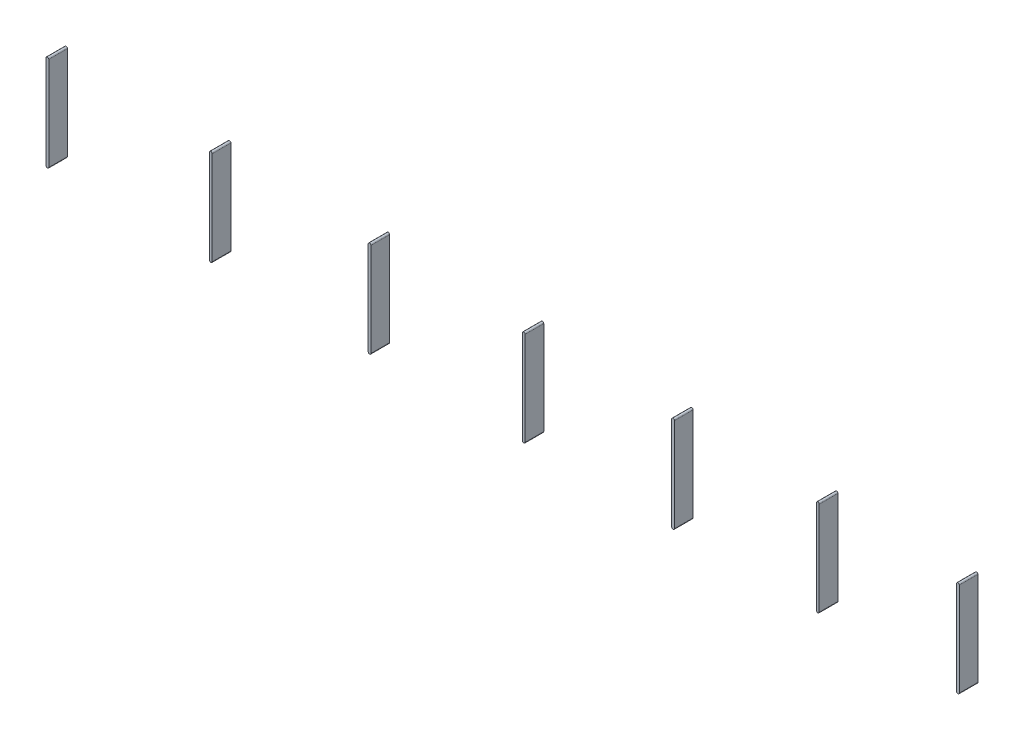
ISO-10303-21;
HEADER;
FILE_DESCRIPTION(('STEP AP214'),'2;1');
FILE_NAME('part.step','',(''),(''),'','','');
FILE_SCHEMA(('AUTOMOTIVE_DESIGN { 1 0 10303 214 1 1 1 1 }'));
ENDSEC;
DATA;
#1=APPLICATION_CONTEXT('core data for automotive mechanical design processes');
#2=APPLICATION_PROTOCOL_DEFINITION('international standard','automotive_design',2000,#1);
#3=PRODUCT_CONTEXT('',#1,'mechanical');
#4=PRODUCT('Part','Part','',(#3));
#5=PRODUCT_RELATED_PRODUCT_CATEGORY('part','',(#4));
#6=PRODUCT_DEFINITION_FORMATION('','',#4);
#7=PRODUCT_DEFINITION_CONTEXT('part definition',#1,'design');
#8=PRODUCT_DEFINITION('design','',#6,#7);
#9=PRODUCT_DEFINITION_SHAPE('','',#8);
#10=(LENGTH_UNIT() NAMED_UNIT(*) SI_UNIT(.MILLI.,.METRE.));
#11=(NAMED_UNIT(*) PLANE_ANGLE_UNIT() SI_UNIT($,.RADIAN.));
#12=(NAMED_UNIT(*) SI_UNIT($,.STERADIAN.) SOLID_ANGLE_UNIT());
#13=UNCERTAINTY_MEASURE_WITH_UNIT(LENGTH_MEASURE(1.E-05),#10,'distance_accuracy_value','');
#14=(GEOMETRIC_REPRESENTATION_CONTEXT(3) GLOBAL_UNCERTAINTY_ASSIGNED_CONTEXT((#13)) GLOBAL_UNIT_ASSIGNED_CONTEXT((#10,
#11,#12)) REPRESENTATION_CONTEXT('',''));
#15=CARTESIAN_POINT('',(0.,0.,0.));
#16=DIRECTION('',(0.,0.,1.));
#17=DIRECTION('',(1.,0.,0.));
#18=AXIS2_PLACEMENT_3D('',#15,#16,#17);
#19=CARTESIAN_POINT('',(-134.,0.,4.));
#20=DIRECTION('',(0.,0.,-1.));
#21=DIRECTION('',(-1.,0.,0.));
#22=AXIS2_PLACEMENT_3D('',#19,#20,#21);
#23=CYLINDRICAL_SURFACE('',#22,0.300000000000022);
#24=CARTESIAN_POINT('',(-134.,0.,0.));
#25=DIRECTION('',(0.,0.,1.));
#26=DIRECTION('',(1.,0.,0.));
#27=AXIS2_PLACEMENT_3D('',#24,#25,#26);
#28=CIRCLE('',#27,0.300000000000022);
#29=CARTESIAN_POINT('',(-133.7,0.,0.));
#30=VERTEX_POINT('',#29);
#31=CARTESIAN_POINT('',(-134.3,0.,0.));
#32=VERTEX_POINT('',#31);
#33=EDGE_CURVE('E107',#30,#32,#28,.T.);
#34=ORIENTED_EDGE('',*,*,#33,.T.);
#35=DIRECTION('',(0.,0.,-1.));
#36=VECTOR('',#35,1.);
#37=CARTESIAN_POINT('',(-134.3,0.,4.));
#38=LINE('',#37,#36);
#39=CARTESIAN_POINT('',(-134.3,0.,4.));
#40=VERTEX_POINT('',#39);
#41=EDGE_CURVE('E12',#40,#32,#38,.T.);
#42=ORIENTED_EDGE('',*,*,#41,.F.);
#43=CARTESIAN_POINT('',(-134.,0.,4.));
#44=DIRECTION('',(0.,0.,1.));
#45=DIRECTION('',(1.,0.,0.));
#46=AXIS2_PLACEMENT_3D('',#43,#44,#45);
#47=CIRCLE('',#46,0.300000000000022);
#48=CARTESIAN_POINT('',(-133.7,0.,4.));
#49=VERTEX_POINT('',#48);
#50=EDGE_CURVE('E95',#49,#40,#47,.T.);
#51=ORIENTED_EDGE('',*,*,#50,.F.);
#52=DIRECTION('',(0.,0.,-1.));
#53=VECTOR('',#52,1.);
#54=CARTESIAN_POINT('',(-133.7,0.,4.));
#55=LINE('',#54,#53);
#56=EDGE_CURVE('E103',#49,#30,#55,.T.);
#57=ORIENTED_EDGE('',*,*,#56,.T.);
#58=EDGE_LOOP('',(#34,#42,#51,#57));
#59=FACE_BOUND('',#58,.T.);
#60=ADVANCED_FACE('F44',(#59),#23,.T.);
#61=CARTESIAN_POINT('',(-134.3,0.,4.));
#62=DIRECTION('',(1.,0.,0.));
#63=DIRECTION('',(0.,0.,-1.));
#64=AXIS2_PLACEMENT_3D('',#61,#62,#63);
#65=PLANE('',#64);
#66=DIRECTION('',(0.,-1.,0.));
#67=VECTOR('',#66,1.);
#68=CARTESIAN_POINT('',(-134.3,0.,0.));
#69=LINE('',#68,#67);
#70=CARTESIAN_POINT('',(-134.3,-20.0000000000001,0.));
#71=VERTEX_POINT('',#70);
#72=EDGE_CURVE('E99',#32,#71,#69,.T.);
#73=ORIENTED_EDGE('',*,*,#72,.T.);
#74=DIRECTION('',(0.,0.,-1.));
#75=VECTOR('',#74,1.);
#76=CARTESIAN_POINT('',(-134.3,-20.0000000000001,4.));
#77=LINE('',#76,#75);
#78=CARTESIAN_POINT('',(-134.3,-20.0000000000001,4.));
#79=VERTEX_POINT('',#78);
#80=EDGE_CURVE('E52',#79,#71,#77,.T.);
#81=ORIENTED_EDGE('',*,*,#80,.F.);
#82=DIRECTION('',(0.,-1.,0.));
#83=VECTOR('',#82,1.);
#84=CARTESIAN_POINT('',(-134.3,0.,4.));
#85=LINE('',#84,#83);
#86=EDGE_CURVE('E90',#40,#79,#85,.T.);
#87=ORIENTED_EDGE('',*,*,#86,.F.);
#88=ORIENTED_EDGE('',*,*,#41,.T.);
#89=EDGE_LOOP('',(#73,#81,#87,#88));
#90=FACE_BOUND('',#89,.T.);
#91=ADVANCED_FACE('F98',(#90),#65,.F.);
#92=CARTESIAN_POINT('',(-134.,-20.0000000000001,4.));
#93=DIRECTION('',(0.,0.,-1.));
#94=DIRECTION('',(-1.,0.,0.));
#95=AXIS2_PLACEMENT_3D('',#92,#93,#94);
#96=CYLINDRICAL_SURFACE('',#95,0.300000000000022);
#97=CARTESIAN_POINT('',(-134.,-20.0000000000001,0.));
#98=DIRECTION('',(0.,0.,1.));
#99=DIRECTION('',(1.,0.,0.));
#100=AXIS2_PLACEMENT_3D('',#97,#98,#99);
#101=CIRCLE('',#100,0.300000000000022);
#102=CARTESIAN_POINT('',(-133.7,-20.0000000000001,0.));
#103=VERTEX_POINT('',#102);
#104=EDGE_CURVE('E77',#71,#103,#101,.T.);
#105=ORIENTED_EDGE('',*,*,#104,.T.);
#106=DIRECTION('',(0.,0.,-1.));
#107=VECTOR('',#106,1.);
#108=CARTESIAN_POINT('',(-133.7,-20.0000000000001,4.));
#109=LINE('',#108,#107);
#110=CARTESIAN_POINT('',(-133.7,-20.0000000000001,4.));
#111=VERTEX_POINT('',#110);
#112=EDGE_CURVE('E100',#111,#103,#109,.T.);
#113=ORIENTED_EDGE('',*,*,#112,.F.);
#114=CARTESIAN_POINT('',(-134.,-20.0000000000001,4.));
#115=DIRECTION('',(0.,0.,1.));
#116=DIRECTION('',(1.,0.,0.));
#117=AXIS2_PLACEMENT_3D('',#114,#115,#116);
#118=CIRCLE('',#117,0.300000000000022);
#119=EDGE_CURVE('E93',#79,#111,#118,.T.);
#120=ORIENTED_EDGE('',*,*,#119,.F.);
#121=ORIENTED_EDGE('',*,*,#80,.T.);
#122=EDGE_LOOP('',(#105,#113,#120,#121));
#123=FACE_BOUND('',#122,.T.);
#124=ADVANCED_FACE('F101',(#123),#96,.T.);
#125=CARTESIAN_POINT('',(-133.7,0.,4.));
#126=DIRECTION('',(-1.,0.,0.));
#127=DIRECTION('',(0.,0.,1.));
#128=AXIS2_PLACEMENT_3D('',#125,#126,#127);
#129=PLANE('',#128);
#130=DIRECTION('',(0.,1.,0.));
#131=VECTOR('',#130,1.);
#132=CARTESIAN_POINT('',(-133.7,0.,0.));
#133=LINE('',#132,#131);
#134=EDGE_CURVE('E83',#103,#30,#133,.T.);
#135=ORIENTED_EDGE('',*,*,#134,.T.);
#136=ORIENTED_EDGE('',*,*,#56,.F.);
#137=DIRECTION('',(0.,1.,0.));
#138=VECTOR('',#137,1.);
#139=CARTESIAN_POINT('',(-133.7,0.,4.));
#140=LINE('',#139,#138);
#141=EDGE_CURVE('E60',#111,#49,#140,.T.);
#142=ORIENTED_EDGE('',*,*,#141,.F.);
#143=ORIENTED_EDGE('',*,*,#112,.T.);
#144=EDGE_LOOP('',(#135,#136,#142,#143));
#145=FACE_BOUND('',#144,.T.);
#146=ADVANCED_FACE('F114',(#145),#129,.F.);
#147=CARTESIAN_POINT('',(-134.,0.,4.));
#148=DIRECTION('',(0.,0.,1.));
#149=DIRECTION('',(1.,0.,0.));
#150=AXIS2_PLACEMENT_3D('',#147,#148,#149);
#151=PLANE('',#150);
#152=ORIENTED_EDGE('',*,*,#50,.T.);
#153=ORIENTED_EDGE('',*,*,#86,.T.);
#154=ORIENTED_EDGE('',*,*,#119,.T.);
#155=ORIENTED_EDGE('',*,*,#141,.T.);
#156=EDGE_LOOP('',(#152,#153,#154,#155));
#157=FACE_BOUND('',#156,.T.);
#158=ADVANCED_FACE('F91',(#157),#151,.T.);
#159=CARTESIAN_POINT('',(-134.,0.,0.));
#160=DIRECTION('',(0.,0.,1.));
#161=DIRECTION('',(1.,0.,0.));
#162=AXIS2_PLACEMENT_3D('',#159,#160,#161);
#163=PLANE('',#162);
#164=ORIENTED_EDGE('',*,*,#33,.F.);
#165=ORIENTED_EDGE('',*,*,#134,.F.);
#166=ORIENTED_EDGE('',*,*,#104,.F.);
#167=ORIENTED_EDGE('',*,*,#72,.F.);
#168=EDGE_LOOP('',(#164,#165,#166,#167));
#169=FACE_BOUND('',#168,.T.);
#170=ADVANCED_FACE('F117',(#169),#163,.F.);
#171=CLOSED_SHELL('',(#60,#91,#124,#146,#158,#170));
#172=MANIFOLD_SOLID_BREP('B2',#171);
#173=CARTESIAN_POINT('',(-99.,0.,4.));
#174=DIRECTION('',(0.,0.,-1.));
#175=DIRECTION('',(-1.,0.,0.));
#176=AXIS2_PLACEMENT_3D('',#173,#174,#175);
#177=CYLINDRICAL_SURFACE('',#176,0.300000000000009);
#178=CARTESIAN_POINT('',(-99.,0.,0.));
#179=DIRECTION('',(0.,0.,1.));
#180=DIRECTION('',(1.,0.,0.));
#181=AXIS2_PLACEMENT_3D('',#178,#179,#180);
#182=CIRCLE('',#181,0.300000000000009);
#183=CARTESIAN_POINT('',(-98.7,0.,0.));
#184=VERTEX_POINT('',#183);
#185=CARTESIAN_POINT('',(-99.3,0.,0.));
#186=VERTEX_POINT('',#185);
#187=EDGE_CURVE('E241',#184,#186,#182,.T.);
#188=ORIENTED_EDGE('',*,*,#187,.T.);
#189=DIRECTION('',(0.,0.,-1.));
#190=VECTOR('',#189,1.);
#191=CARTESIAN_POINT('',(-99.3,0.,4.));
#192=LINE('',#191,#190);
#193=CARTESIAN_POINT('',(-99.3,0.,4.));
#194=VERTEX_POINT('',#193);
#195=EDGE_CURVE('E42',#194,#186,#192,.T.);
#196=ORIENTED_EDGE('',*,*,#195,.F.);
#197=CARTESIAN_POINT('',(-99.,0.,4.));
#198=DIRECTION('',(0.,0.,1.));
#199=DIRECTION('',(1.,0.,0.));
#200=AXIS2_PLACEMENT_3D('',#197,#198,#199);
#201=CIRCLE('',#200,0.300000000000009);
#202=CARTESIAN_POINT('',(-98.7,0.,4.));
#203=VERTEX_POINT('',#202);
#204=EDGE_CURVE('E229',#203,#194,#201,.T.);
#205=ORIENTED_EDGE('',*,*,#204,.F.);
#206=DIRECTION('',(0.,0.,-1.));
#207=VECTOR('',#206,1.);
#208=CARTESIAN_POINT('',(-98.7,0.,4.));
#209=LINE('',#208,#207);
#210=EDGE_CURVE('E237',#203,#184,#209,.T.);
#211=ORIENTED_EDGE('',*,*,#210,.T.);
#212=EDGE_LOOP('',(#188,#196,#205,#211));
#213=FACE_BOUND('',#212,.T.);
#214=ADVANCED_FACE('F178',(#213),#177,.T.);
#215=CARTESIAN_POINT('',(-99.3,0.,4.));
#216=DIRECTION('',(1.,0.,0.));
#217=DIRECTION('',(0.,0.,-1.));
#218=AXIS2_PLACEMENT_3D('',#215,#216,#217);
#219=PLANE('',#218);
#220=DIRECTION('',(0.,-1.,0.));
#221=VECTOR('',#220,1.);
#222=CARTESIAN_POINT('',(-99.3,0.,0.));
#223=LINE('',#222,#221);
#224=CARTESIAN_POINT('',(-99.3,-20.0000000000001,0.));
#225=VERTEX_POINT('',#224);
#226=EDGE_CURVE('E233',#186,#225,#223,.T.);
#227=ORIENTED_EDGE('',*,*,#226,.T.);
#228=DIRECTION('',(0.,0.,-1.));
#229=VECTOR('',#228,1.);
#230=CARTESIAN_POINT('',(-99.3,-20.0000000000001,4.));
#231=LINE('',#230,#229);
#232=CARTESIAN_POINT('',(-99.3,-20.0000000000001,4.));
#233=VERTEX_POINT('',#232);
#234=EDGE_CURVE('E186',#233,#225,#231,.T.);
#235=ORIENTED_EDGE('',*,*,#234,.F.);
#236=DIRECTION('',(0.,-1.,0.));
#237=VECTOR('',#236,1.);
#238=CARTESIAN_POINT('',(-99.3,0.,4.));
#239=LINE('',#238,#237);
#240=EDGE_CURVE('E224',#194,#233,#239,.T.);
#241=ORIENTED_EDGE('',*,*,#240,.F.);
#242=ORIENTED_EDGE('',*,*,#195,.T.);
#243=EDGE_LOOP('',(#227,#235,#241,#242));
#244=FACE_BOUND('',#243,.T.);
#245=ADVANCED_FACE('F232',(#244),#219,.F.);
#246=CARTESIAN_POINT('',(-99.,-20.0000000000001,4.));
#247=DIRECTION('',(0.,0.,-1.));
#248=DIRECTION('',(-1.,0.,0.));
#249=AXIS2_PLACEMENT_3D('',#246,#247,#248);
#250=CYLINDRICAL_SURFACE('',#249,0.300000000000009);
#251=CARTESIAN_POINT('',(-99.,-20.0000000000001,0.));
#252=DIRECTION('',(0.,0.,1.));
#253=DIRECTION('',(1.,0.,0.));
#254=AXIS2_PLACEMENT_3D('',#251,#252,#253);
#255=CIRCLE('',#254,0.300000000000009);
#256=CARTESIAN_POINT('',(-98.7,-20.0000000000001,0.));
#257=VERTEX_POINT('',#256);
#258=EDGE_CURVE('E211',#225,#257,#255,.T.);
#259=ORIENTED_EDGE('',*,*,#258,.T.);
#260=DIRECTION('',(0.,0.,-1.));
#261=VECTOR('',#260,1.);
#262=CARTESIAN_POINT('',(-98.7,-20.0000000000001,4.));
#263=LINE('',#262,#261);
#264=CARTESIAN_POINT('',(-98.7,-20.0000000000001,4.));
#265=VERTEX_POINT('',#264);
#266=EDGE_CURVE('E234',#265,#257,#263,.T.);
#267=ORIENTED_EDGE('',*,*,#266,.F.);
#268=CARTESIAN_POINT('',(-99.,-20.0000000000001,4.));
#269=DIRECTION('',(0.,0.,1.));
#270=DIRECTION('',(1.,0.,0.));
#271=AXIS2_PLACEMENT_3D('',#268,#269,#270);
#272=CIRCLE('',#271,0.300000000000009);
#273=EDGE_CURVE('E227',#233,#265,#272,.T.);
#274=ORIENTED_EDGE('',*,*,#273,.F.);
#275=ORIENTED_EDGE('',*,*,#234,.T.);
#276=EDGE_LOOP('',(#259,#267,#274,#275));
#277=FACE_BOUND('',#276,.T.);
#278=ADVANCED_FACE('F235',(#277),#250,.T.);
#279=CARTESIAN_POINT('',(-98.7,0.,4.));
#280=DIRECTION('',(-1.,0.,0.));
#281=DIRECTION('',(0.,0.,1.));
#282=AXIS2_PLACEMENT_3D('',#279,#280,#281);
#283=PLANE('',#282);
#284=DIRECTION('',(0.,1.,0.));
#285=VECTOR('',#284,1.);
#286=CARTESIAN_POINT('',(-98.7,0.,0.));
#287=LINE('',#286,#285);
#288=EDGE_CURVE('E217',#257,#184,#287,.T.);
#289=ORIENTED_EDGE('',*,*,#288,.T.);
#290=ORIENTED_EDGE('',*,*,#210,.F.);
#291=DIRECTION('',(0.,1.,0.));
#292=VECTOR('',#291,1.);
#293=CARTESIAN_POINT('',(-98.7,0.,4.));
#294=LINE('',#293,#292);
#295=EDGE_CURVE('E194',#265,#203,#294,.T.);
#296=ORIENTED_EDGE('',*,*,#295,.F.);
#297=ORIENTED_EDGE('',*,*,#266,.T.);
#298=EDGE_LOOP('',(#289,#290,#296,#297));
#299=FACE_BOUND('',#298,.T.);
#300=ADVANCED_FACE('F248',(#299),#283,.F.);
#301=CARTESIAN_POINT('',(-99.,0.,4.));
#302=DIRECTION('',(0.,0.,1.));
#303=DIRECTION('',(1.,0.,0.));
#304=AXIS2_PLACEMENT_3D('',#301,#302,#303);
#305=PLANE('',#304);
#306=ORIENTED_EDGE('',*,*,#204,.T.);
#307=ORIENTED_EDGE('',*,*,#240,.T.);
#308=ORIENTED_EDGE('',*,*,#273,.T.);
#309=ORIENTED_EDGE('',*,*,#295,.T.);
#310=EDGE_LOOP('',(#306,#307,#308,#309));
#311=FACE_BOUND('',#310,.T.);
#312=ADVANCED_FACE('F225',(#311),#305,.T.);
#313=CARTESIAN_POINT('',(-99.,0.,0.));
#314=DIRECTION('',(0.,0.,1.));
#315=DIRECTION('',(1.,0.,0.));
#316=AXIS2_PLACEMENT_3D('',#313,#314,#315);
#317=PLANE('',#316);
#318=ORIENTED_EDGE('',*,*,#187,.F.);
#319=ORIENTED_EDGE('',*,*,#288,.F.);
#320=ORIENTED_EDGE('',*,*,#258,.F.);
#321=ORIENTED_EDGE('',*,*,#226,.F.);
#322=EDGE_LOOP('',(#318,#319,#320,#321));
#323=FACE_BOUND('',#322,.T.);
#324=ADVANCED_FACE('F251',(#323),#317,.F.);
#325=CLOSED_SHELL('',(#214,#245,#278,#300,#312,#324));
#326=MANIFOLD_SOLID_BREP('B6',#325);
#327=CARTESIAN_POINT('',(-65.,0.,4.));
#328=DIRECTION('',(0.,0.,-1.));
#329=DIRECTION('',(-1.,0.,0.));
#330=AXIS2_PLACEMENT_3D('',#327,#328,#329);
#331=CYLINDRICAL_SURFACE('',#330,0.299999999999995);
#332=CARTESIAN_POINT('',(-65.,0.,0.));
#333=DIRECTION('',(0.,0.,1.));
#334=DIRECTION('',(1.,0.,0.));
#335=AXIS2_PLACEMENT_3D('',#332,#333,#334);
#336=CIRCLE('',#335,0.299999999999995);
#337=CARTESIAN_POINT('',(-64.7,0.,0.));
#338=VERTEX_POINT('',#337);
#339=CARTESIAN_POINT('',(-65.3,0.,0.));
#340=VERTEX_POINT('',#339);
#341=EDGE_CURVE('E375',#338,#340,#336,.T.);
#342=ORIENTED_EDGE('',*,*,#341,.T.);
#343=DIRECTION('',(0.,0.,-1.));
#344=VECTOR('',#343,1.);
#345=CARTESIAN_POINT('',(-65.3,0.,4.));
#346=LINE('',#345,#344);
#347=CARTESIAN_POINT('',(-65.3,0.,4.));
#348=VERTEX_POINT('',#347);
#349=EDGE_CURVE('E176',#348,#340,#346,.T.);
#350=ORIENTED_EDGE('',*,*,#349,.F.);
#351=CARTESIAN_POINT('',(-65.,0.,4.));
#352=DIRECTION('',(0.,0.,1.));
#353=DIRECTION('',(1.,0.,0.));
#354=AXIS2_PLACEMENT_3D('',#351,#352,#353);
#355=CIRCLE('',#354,0.299999999999995);
#356=CARTESIAN_POINT('',(-64.7,0.,4.));
#357=VERTEX_POINT('',#356);
#358=EDGE_CURVE('E363',#357,#348,#355,.T.);
#359=ORIENTED_EDGE('',*,*,#358,.F.);
#360=DIRECTION('',(0.,0.,-1.));
#361=VECTOR('',#360,1.);
#362=CARTESIAN_POINT('',(-64.7,0.,4.));
#363=LINE('',#362,#361);
#364=EDGE_CURVE('E371',#357,#338,#363,.T.);
#365=ORIENTED_EDGE('',*,*,#364,.T.);
#366=EDGE_LOOP('',(#342,#350,#359,#365));
#367=FACE_BOUND('',#366,.T.);
#368=ADVANCED_FACE('F312',(#367),#331,.T.);
#369=CARTESIAN_POINT('',(-65.3,0.,4.));
#370=DIRECTION('',(1.,0.,0.));
#371=DIRECTION('',(0.,1.,0.));
#372=AXIS2_PLACEMENT_3D('',#369,#370,#371);
#373=PLANE('',#372);
#374=DIRECTION('',(0.,-1.,0.));
#375=VECTOR('',#374,1.);
#376=CARTESIAN_POINT('',(-65.3,0.,0.));
#377=LINE('',#376,#375);
#378=CARTESIAN_POINT('',(-65.3,-20.,0.));
#379=VERTEX_POINT('',#378);
#380=EDGE_CURVE('E367',#340,#379,#377,.T.);
#381=ORIENTED_EDGE('',*,*,#380,.T.);
#382=DIRECTION('',(0.,0.,-1.));
#383=VECTOR('',#382,1.);
#384=CARTESIAN_POINT('',(-65.3,-20.,4.));
#385=LINE('',#384,#383);
#386=CARTESIAN_POINT('',(-65.3,-20.,4.));
#387=VERTEX_POINT('',#386);
#388=EDGE_CURVE('E320',#387,#379,#385,.T.);
#389=ORIENTED_EDGE('',*,*,#388,.F.);
#390=DIRECTION('',(0.,-1.,0.));
#391=VECTOR('',#390,1.);
#392=CARTESIAN_POINT('',(-65.3,0.,4.));
#393=LINE('',#392,#391);
#394=EDGE_CURVE('E358',#348,#387,#393,.T.);
#395=ORIENTED_EDGE('',*,*,#394,.F.);
#396=ORIENTED_EDGE('',*,*,#349,.T.);
#397=EDGE_LOOP('',(#381,#389,#395,#396));
#398=FACE_BOUND('',#397,.T.);
#399=ADVANCED_FACE('F366',(#398),#373,.F.);
#400=CARTESIAN_POINT('',(-65.,-20.,4.));
#401=DIRECTION('',(0.,0.,-1.));
#402=DIRECTION('',(-1.,0.,0.));
#403=AXIS2_PLACEMENT_3D('',#400,#401,#402);
#404=CYLINDRICAL_SURFACE('',#403,0.299999999999981);
#405=CARTESIAN_POINT('',(-65.,-20.,0.));
#406=DIRECTION('',(0.,0.,1.));
#407=DIRECTION('',(1.,0.,0.));
#408=AXIS2_PLACEMENT_3D('',#405,#406,#407);
#409=CIRCLE('',#408,0.299999999999981);
#410=CARTESIAN_POINT('',(-64.7,-20.,0.));
#411=VERTEX_POINT('',#410);
#412=EDGE_CURVE('E345',#379,#411,#409,.T.);
#413=ORIENTED_EDGE('',*,*,#412,.T.);
#414=DIRECTION('',(0.,0.,-1.));
#415=VECTOR('',#414,1.);
#416=CARTESIAN_POINT('',(-64.7,-20.,4.));
#417=LINE('',#416,#415);
#418=CARTESIAN_POINT('',(-64.7,-20.,4.));
#419=VERTEX_POINT('',#418);
#420=EDGE_CURVE('E368',#419,#411,#417,.T.);
#421=ORIENTED_EDGE('',*,*,#420,.F.);
#422=CARTESIAN_POINT('',(-65.,-20.,4.));
#423=DIRECTION('',(0.,0.,1.));
#424=DIRECTION('',(1.,0.,0.));
#425=AXIS2_PLACEMENT_3D('',#422,#423,#424);
#426=CIRCLE('',#425,0.299999999999981);
#427=EDGE_CURVE('E361',#387,#419,#426,.T.);
#428=ORIENTED_EDGE('',*,*,#427,.F.);
#429=ORIENTED_EDGE('',*,*,#388,.T.);
#430=EDGE_LOOP('',(#413,#421,#428,#429));
#431=FACE_BOUND('',#430,.T.);
#432=ADVANCED_FACE('F369',(#431),#404,.T.);
#433=CARTESIAN_POINT('',(-64.7,0.,4.));
#434=DIRECTION('',(-1.,0.,0.));
#435=DIRECTION('',(0.,-1.,0.));
#436=AXIS2_PLACEMENT_3D('',#433,#434,#435);
#437=PLANE('',#436);
#438=DIRECTION('',(0.,1.,0.));
#439=VECTOR('',#438,1.);
#440=CARTESIAN_POINT('',(-64.7,0.,0.));
#441=LINE('',#440,#439);
#442=EDGE_CURVE('E351',#411,#338,#441,.T.);
#443=ORIENTED_EDGE('',*,*,#442,.T.);
#444=ORIENTED_EDGE('',*,*,#364,.F.);
#445=DIRECTION('',(0.,1.,0.));
#446=VECTOR('',#445,1.);
#447=CARTESIAN_POINT('',(-64.7,0.,4.));
#448=LINE('',#447,#446);
#449=EDGE_CURVE('E328',#419,#357,#448,.T.);
#450=ORIENTED_EDGE('',*,*,#449,.F.);
#451=ORIENTED_EDGE('',*,*,#420,.T.);
#452=EDGE_LOOP('',(#443,#444,#450,#451));
#453=FACE_BOUND('',#452,.T.);
#454=ADVANCED_FACE('F382',(#453),#437,.F.);
#455=CARTESIAN_POINT('',(-65.,0.,4.));
#456=DIRECTION('',(0.,0.,1.));
#457=DIRECTION('',(1.,0.,0.));
#458=AXIS2_PLACEMENT_3D('',#455,#456,#457);
#459=PLANE('',#458);
#460=ORIENTED_EDGE('',*,*,#358,.T.);
#461=ORIENTED_EDGE('',*,*,#394,.T.);
#462=ORIENTED_EDGE('',*,*,#427,.T.);
#463=ORIENTED_EDGE('',*,*,#449,.T.);
#464=EDGE_LOOP('',(#460,#461,#462,#463));
#465=FACE_BOUND('',#464,.T.);
#466=ADVANCED_FACE('F359',(#465),#459,.T.);
#467=CARTESIAN_POINT('',(-65.,0.,0.));
#468=DIRECTION('',(0.,0.,1.));
#469=DIRECTION('',(1.,0.,0.));
#470=AXIS2_PLACEMENT_3D('',#467,#468,#469);
#471=PLANE('',#470);
#472=ORIENTED_EDGE('',*,*,#341,.F.);
#473=ORIENTED_EDGE('',*,*,#442,.F.);
#474=ORIENTED_EDGE('',*,*,#412,.F.);
#475=ORIENTED_EDGE('',*,*,#380,.F.);
#476=EDGE_LOOP('',(#472,#473,#474,#475));
#477=FACE_BOUND('',#476,.T.);
#478=ADVANCED_FACE('F385',(#477),#471,.F.);
#479=CLOSED_SHELL('',(#368,#399,#432,#454,#466,#478));
#480=MANIFOLD_SOLID_BREP('B36',#479);
#481=CARTESIAN_POINT('',(-32.,0.,4.));
#482=DIRECTION('',(0.,0.,-1.));
#483=DIRECTION('',(-1.,0.,0.));
#484=AXIS2_PLACEMENT_3D('',#481,#482,#483);
#485=CYLINDRICAL_SURFACE('',#484,0.300000000000002);
#486=CARTESIAN_POINT('',(-32.,0.,0.));
#487=DIRECTION('',(0.,0.,1.));
#488=DIRECTION('',(1.,0.,0.));
#489=AXIS2_PLACEMENT_3D('',#486,#487,#488);
#490=CIRCLE('',#489,0.300000000000002);
#491=CARTESIAN_POINT('',(-31.7,0.,0.));
#492=VERTEX_POINT('',#491);
#493=CARTESIAN_POINT('',(-32.3,0.,0.));
#494=VERTEX_POINT('',#493);
#495=EDGE_CURVE('E509',#492,#494,#490,.T.);
#496=ORIENTED_EDGE('',*,*,#495,.T.);
#497=DIRECTION('',(0.,0.,-1.));
#498=VECTOR('',#497,1.);
#499=CARTESIAN_POINT('',(-32.3,0.,4.));
#500=LINE('',#499,#498);
#501=CARTESIAN_POINT('',(-32.3,0.,4.));
#502=VERTEX_POINT('',#501);
#503=EDGE_CURVE('E310',#502,#494,#500,.T.);
#504=ORIENTED_EDGE('',*,*,#503,.F.);
#505=CARTESIAN_POINT('',(-32.,0.,4.));
#506=DIRECTION('',(0.,0.,1.));
#507=DIRECTION('',(1.,0.,0.));
#508=AXIS2_PLACEMENT_3D('',#505,#506,#507);
#509=CIRCLE('',#508,0.300000000000002);
#510=CARTESIAN_POINT('',(-31.7,0.,4.));
#511=VERTEX_POINT('',#510);
#512=EDGE_CURVE('E497',#511,#502,#509,.T.);
#513=ORIENTED_EDGE('',*,*,#512,.F.);
#514=DIRECTION('',(0.,0.,-1.));
#515=VECTOR('',#514,1.);
#516=CARTESIAN_POINT('',(-31.7,0.,4.));
#517=LINE('',#516,#515);
#518=EDGE_CURVE('E505',#511,#492,#517,.T.);
#519=ORIENTED_EDGE('',*,*,#518,.T.);
#520=EDGE_LOOP('',(#496,#504,#513,#519));
#521=FACE_BOUND('',#520,.T.);
#522=ADVANCED_FACE('F446',(#521),#485,.T.);
#523=CARTESIAN_POINT('',(-32.3,0.,4.));
#524=DIRECTION('',(1.,0.,0.));
#525=DIRECTION('',(0.,0.,-1.));
#526=AXIS2_PLACEMENT_3D('',#523,#524,#525);
#527=PLANE('',#526);
#528=DIRECTION('',(0.,-1.,0.));
#529=VECTOR('',#528,1.);
#530=CARTESIAN_POINT('',(-32.3,0.,0.));
#531=LINE('',#530,#529);
#532=CARTESIAN_POINT('',(-32.3,-20.,0.));
#533=VERTEX_POINT('',#532);
#534=EDGE_CURVE('E501',#494,#533,#531,.T.);
#535=ORIENTED_EDGE('',*,*,#534,.T.);
#536=DIRECTION('',(0.,0.,-1.));
#537=VECTOR('',#536,1.);
#538=CARTESIAN_POINT('',(-32.3,-20.,4.));
#539=LINE('',#538,#537);
#540=CARTESIAN_POINT('',(-32.3,-20.,4.));
#541=VERTEX_POINT('',#540);
#542=EDGE_CURVE('E454',#541,#533,#539,.T.);
#543=ORIENTED_EDGE('',*,*,#542,.F.);
#544=DIRECTION('',(0.,-1.,0.));
#545=VECTOR('',#544,1.);
#546=CARTESIAN_POINT('',(-32.3,0.,4.));
#547=LINE('',#546,#545);
#548=EDGE_CURVE('E492',#502,#541,#547,.T.);
#549=ORIENTED_EDGE('',*,*,#548,.F.);
#550=ORIENTED_EDGE('',*,*,#503,.T.);
#551=EDGE_LOOP('',(#535,#543,#549,#550));
#552=FACE_BOUND('',#551,.T.);
#553=ADVANCED_FACE('F500',(#552),#527,.F.);
#554=CARTESIAN_POINT('',(-32.,-20.,4.));
#555=DIRECTION('',(0.,0.,-1.));
#556=DIRECTION('',(-1.,0.,0.));
#557=AXIS2_PLACEMENT_3D('',#554,#555,#556);
#558=CYLINDRICAL_SURFACE('',#557,0.300000000000005);
#559=CARTESIAN_POINT('',(-32.,-20.,0.));
#560=DIRECTION('',(0.,0.,1.));
#561=DIRECTION('',(1.,0.,0.));
#562=AXIS2_PLACEMENT_3D('',#559,#560,#561);
#563=CIRCLE('',#562,0.300000000000005);
#564=CARTESIAN_POINT('',(-31.7,-20.,0.));
#565=VERTEX_POINT('',#564);
#566=EDGE_CURVE('E479',#533,#565,#563,.T.);
#567=ORIENTED_EDGE('',*,*,#566,.T.);
#568=DIRECTION('',(0.,0.,-1.));
#569=VECTOR('',#568,1.);
#570=CARTESIAN_POINT('',(-31.7,-20.,4.));
#571=LINE('',#570,#569);
#572=CARTESIAN_POINT('',(-31.7,-20.,4.));
#573=VERTEX_POINT('',#572);
#574=EDGE_CURVE('E502',#573,#565,#571,.T.);
#575=ORIENTED_EDGE('',*,*,#574,.F.);
#576=CARTESIAN_POINT('',(-32.,-20.,4.));
#577=DIRECTION('',(0.,0.,1.));
#578=DIRECTION('',(1.,0.,0.));
#579=AXIS2_PLACEMENT_3D('',#576,#577,#578);
#580=CIRCLE('',#579,0.300000000000005);
#581=EDGE_CURVE('E495',#541,#573,#580,.T.);
#582=ORIENTED_EDGE('',*,*,#581,.F.);
#583=ORIENTED_EDGE('',*,*,#542,.T.);
#584=EDGE_LOOP('',(#567,#575,#582,#583));
#585=FACE_BOUND('',#584,.T.);
#586=ADVANCED_FACE('F503',(#585),#558,.T.);
#587=CARTESIAN_POINT('',(-31.7,0.,4.));
#588=DIRECTION('',(-1.,0.,0.));
#589=DIRECTION('',(0.,-1.,0.));
#590=AXIS2_PLACEMENT_3D('',#587,#588,#589);
#591=PLANE('',#590);
#592=DIRECTION('',(0.,1.,0.));
#593=VECTOR('',#592,1.);
#594=CARTESIAN_POINT('',(-31.7,0.,0.));
#595=LINE('',#594,#593);
#596=EDGE_CURVE('E485',#565,#492,#595,.T.);
#597=ORIENTED_EDGE('',*,*,#596,.T.);
#598=ORIENTED_EDGE('',*,*,#518,.F.);
#599=DIRECTION('',(0.,1.,0.));
#600=VECTOR('',#599,1.);
#601=CARTESIAN_POINT('',(-31.7,0.,4.));
#602=LINE('',#601,#600);
#603=EDGE_CURVE('E462',#573,#511,#602,.T.);
#604=ORIENTED_EDGE('',*,*,#603,.F.);
#605=ORIENTED_EDGE('',*,*,#574,.T.);
#606=EDGE_LOOP('',(#597,#598,#604,#605));
#607=FACE_BOUND('',#606,.T.);
#608=ADVANCED_FACE('F516',(#607),#591,.F.);
#609=CARTESIAN_POINT('',(-32.,0.,4.));
#610=DIRECTION('',(0.,0.,1.));
#611=DIRECTION('',(1.,0.,0.));
#612=AXIS2_PLACEMENT_3D('',#609,#610,#611);
#613=PLANE('',#612);
#614=ORIENTED_EDGE('',*,*,#512,.T.);
#615=ORIENTED_EDGE('',*,*,#548,.T.);
#616=ORIENTED_EDGE('',*,*,#581,.T.);
#617=ORIENTED_EDGE('',*,*,#603,.T.);
#618=EDGE_LOOP('',(#614,#615,#616,#617));
#619=FACE_BOUND('',#618,.T.);
#620=ADVANCED_FACE('F493',(#619),#613,.T.);
#621=CARTESIAN_POINT('',(-32.,0.,0.));
#622=DIRECTION('',(0.,0.,1.));
#623=DIRECTION('',(1.,0.,0.));
#624=AXIS2_PLACEMENT_3D('',#621,#622,#623);
#625=PLANE('',#624);
#626=ORIENTED_EDGE('',*,*,#495,.F.);
#627=ORIENTED_EDGE('',*,*,#596,.F.);
#628=ORIENTED_EDGE('',*,*,#566,.F.);
#629=ORIENTED_EDGE('',*,*,#534,.F.);
#630=EDGE_LOOP('',(#626,#627,#628,#629));
#631=FACE_BOUND('',#630,.T.);
#632=ADVANCED_FACE('F519',(#631),#625,.F.);
#633=CLOSED_SHELL('',(#522,#553,#586,#608,#620,#632));
#634=MANIFOLD_SOLID_BREP('B170',#633);
#635=CARTESIAN_POINT('',(31.,0.,4.));
#636=DIRECTION('',(0.,0.,-1.));
#637=DIRECTION('',(-1.,0.,0.));
#638=AXIS2_PLACEMENT_3D('',#635,#636,#637);
#639=CYLINDRICAL_SURFACE('',#638,0.300000000000009);
#640=CARTESIAN_POINT('',(31.,0.,0.));
#641=DIRECTION('',(0.,0.,1.));
#642=DIRECTION('',(1.,0.,0.));
#643=AXIS2_PLACEMENT_3D('',#640,#641,#642);
#644=CIRCLE('',#643,0.300000000000009);
#645=CARTESIAN_POINT('',(31.3,0.,0.));
#646=VERTEX_POINT('',#645);
#647=CARTESIAN_POINT('',(30.7,0.,0.));
#648=VERTEX_POINT('',#647);
#649=EDGE_CURVE('E643',#646,#648,#644,.T.);
#650=ORIENTED_EDGE('',*,*,#649,.T.);
#651=DIRECTION('',(0.,0.,-1.));
#652=VECTOR('',#651,1.);
#653=CARTESIAN_POINT('',(30.7,0.,4.));
#654=LINE('',#653,#652);
#655=CARTESIAN_POINT('',(30.7,0.,4.));
#656=VERTEX_POINT('',#655);
#657=EDGE_CURVE('E444',#656,#648,#654,.T.);
#658=ORIENTED_EDGE('',*,*,#657,.F.);
#659=CARTESIAN_POINT('',(31.,0.,4.));
#660=DIRECTION('',(0.,0.,1.));
#661=DIRECTION('',(1.,0.,0.));
#662=AXIS2_PLACEMENT_3D('',#659,#660,#661);
#663=CIRCLE('',#662,0.300000000000009);
#664=CARTESIAN_POINT('',(31.3,0.,4.));
#665=VERTEX_POINT('',#664);
#666=EDGE_CURVE('E631',#665,#656,#663,.T.);
#667=ORIENTED_EDGE('',*,*,#666,.F.);
#668=DIRECTION('',(0.,0.,-1.));
#669=VECTOR('',#668,1.);
#670=CARTESIAN_POINT('',(31.3,0.,4.));
#671=LINE('',#670,#669);
#672=EDGE_CURVE('E639',#665,#646,#671,.T.);
#673=ORIENTED_EDGE('',*,*,#672,.T.);
#674=EDGE_LOOP('',(#650,#658,#667,#673));
#675=FACE_BOUND('',#674,.T.);
#676=ADVANCED_FACE('F580',(#675),#639,.T.);
#677=CARTESIAN_POINT('',(30.7,0.,4.));
#678=DIRECTION('',(1.,0.,0.));
#679=DIRECTION('',(0.,1.,0.));
#680=AXIS2_PLACEMENT_3D('',#677,#678,#679);
#681=PLANE('',#680);
#682=DIRECTION('',(0.,-1.,0.));
#683=VECTOR('',#682,1.);
#684=CARTESIAN_POINT('',(30.7,0.,0.));
#685=LINE('',#684,#683);
#686=CARTESIAN_POINT('',(30.7,-20.,0.));
#687=VERTEX_POINT('',#686);
#688=EDGE_CURVE('E635',#648,#687,#685,.T.);
#689=ORIENTED_EDGE('',*,*,#688,.T.);
#690=DIRECTION('',(0.,0.,-1.));
#691=VECTOR('',#690,1.);
#692=CARTESIAN_POINT('',(30.7,-20.,4.));
#693=LINE('',#692,#691);
#694=CARTESIAN_POINT('',(30.7,-20.,4.));
#695=VERTEX_POINT('',#694);
#696=EDGE_CURVE('E588',#695,#687,#693,.T.);
#697=ORIENTED_EDGE('',*,*,#696,.F.);
#698=DIRECTION('',(0.,-1.,0.));
#699=VECTOR('',#698,1.);
#700=CARTESIAN_POINT('',(30.7,0.,4.));
#701=LINE('',#700,#699);
#702=EDGE_CURVE('E626',#656,#695,#701,.T.);
#703=ORIENTED_EDGE('',*,*,#702,.F.);
#704=ORIENTED_EDGE('',*,*,#657,.T.);
#705=EDGE_LOOP('',(#689,#697,#703,#704));
#706=FACE_BOUND('',#705,.T.);
#707=ADVANCED_FACE('F634',(#706),#681,.F.);
#708=CARTESIAN_POINT('',(31.,-20.,4.));
#709=DIRECTION('',(0.,0.,-1.));
#710=DIRECTION('',(-1.,0.,0.));
#711=AXIS2_PLACEMENT_3D('',#708,#709,#710);
#712=CYLINDRICAL_SURFACE('',#711,0.3);
#713=CARTESIAN_POINT('',(31.,-20.,0.));
#714=DIRECTION('',(0.,0.,1.));
#715=DIRECTION('',(1.,0.,0.));
#716=AXIS2_PLACEMENT_3D('',#713,#714,#715);
#717=CIRCLE('',#716,0.3);
#718=CARTESIAN_POINT('',(31.3,-20.,0.));
#719=VERTEX_POINT('',#718);
#720=EDGE_CURVE('E613',#687,#719,#717,.T.);
#721=ORIENTED_EDGE('',*,*,#720,.T.);
#722=DIRECTION('',(0.,0.,-1.));
#723=VECTOR('',#722,1.);
#724=CARTESIAN_POINT('',(31.3,-20.,4.));
#725=LINE('',#724,#723);
#726=CARTESIAN_POINT('',(31.3,-20.,4.));
#727=VERTEX_POINT('',#726);
#728=EDGE_CURVE('E636',#727,#719,#725,.T.);
#729=ORIENTED_EDGE('',*,*,#728,.F.);
#730=CARTESIAN_POINT('',(31.,-20.,4.));
#731=DIRECTION('',(0.,0.,1.));
#732=DIRECTION('',(1.,0.,0.));
#733=AXIS2_PLACEMENT_3D('',#730,#731,#732);
#734=CIRCLE('',#733,0.3);
#735=EDGE_CURVE('E629',#695,#727,#734,.T.);
#736=ORIENTED_EDGE('',*,*,#735,.F.);
#737=ORIENTED_EDGE('',*,*,#696,.T.);
#738=EDGE_LOOP('',(#721,#729,#736,#737));
#739=FACE_BOUND('',#738,.T.);
#740=ADVANCED_FACE('F637',(#739),#712,.T.);
#741=CARTESIAN_POINT('',(31.3,0.,4.));
#742=DIRECTION('',(-1.,0.,0.));
#743=DIRECTION('',(0.,-1.,0.));
#744=AXIS2_PLACEMENT_3D('',#741,#742,#743);
#745=PLANE('',#744);
#746=DIRECTION('',(0.,1.,0.));
#747=VECTOR('',#746,1.);
#748=CARTESIAN_POINT('',(31.3,0.,0.));
#749=LINE('',#748,#747);
#750=EDGE_CURVE('E619',#719,#646,#749,.T.);
#751=ORIENTED_EDGE('',*,*,#750,.T.);
#752=ORIENTED_EDGE('',*,*,#672,.F.);
#753=DIRECTION('',(0.,1.,0.));
#754=VECTOR('',#753,1.);
#755=CARTESIAN_POINT('',(31.3,0.,4.));
#756=LINE('',#755,#754);
#757=EDGE_CURVE('E596',#727,#665,#756,.T.);
#758=ORIENTED_EDGE('',*,*,#757,.F.);
#759=ORIENTED_EDGE('',*,*,#728,.T.);
#760=EDGE_LOOP('',(#751,#752,#758,#759));
#761=FACE_BOUND('',#760,.T.);
#762=ADVANCED_FACE('F650',(#761),#745,.F.);
#763=CARTESIAN_POINT('',(31.,0.,4.));
#764=DIRECTION('',(0.,0.,1.));
#765=DIRECTION('',(1.,0.,0.));
#766=AXIS2_PLACEMENT_3D('',#763,#764,#765);
#767=PLANE('',#766);
#768=ORIENTED_EDGE('',*,*,#666,.T.);
#769=ORIENTED_EDGE('',*,*,#702,.T.);
#770=ORIENTED_EDGE('',*,*,#735,.T.);
#771=ORIENTED_EDGE('',*,*,#757,.T.);
#772=EDGE_LOOP('',(#768,#769,#770,#771));
#773=FACE_BOUND('',#772,.T.);
#774=ADVANCED_FACE('F627',(#773),#767,.T.);
#775=CARTESIAN_POINT('',(31.,0.,0.));
#776=DIRECTION('',(0.,0.,1.));
#777=DIRECTION('',(1.,0.,0.));
#778=AXIS2_PLACEMENT_3D('',#775,#776,#777);
#779=PLANE('',#778);
#780=ORIENTED_EDGE('',*,*,#649,.F.);
#781=ORIENTED_EDGE('',*,*,#750,.F.);
#782=ORIENTED_EDGE('',*,*,#720,.F.);
#783=ORIENTED_EDGE('',*,*,#688,.F.);
#784=EDGE_LOOP('',(#780,#781,#782,#783));
#785=FACE_BOUND('',#784,.T.);
#786=ADVANCED_FACE('F653',(#785),#779,.F.);
#787=CLOSED_SHELL('',(#676,#707,#740,#762,#774,#786));
#788=MANIFOLD_SOLID_BREP('B304',#787);
#789=CARTESIAN_POINT('',(61.,0.,4.));
#790=DIRECTION('',(0.,0.,-1.));
#791=DIRECTION('',(-1.,0.,0.));
#792=AXIS2_PLACEMENT_3D('',#789,#790,#791);
#793=CYLINDRICAL_SURFACE('',#792,0.299999999999988);
#794=CARTESIAN_POINT('',(61.,0.,0.));
#795=DIRECTION('',(0.,0.,1.));
#796=DIRECTION('',(1.,0.,0.));
#797=AXIS2_PLACEMENT_3D('',#794,#795,#796);
#798=CIRCLE('',#797,0.299999999999988);
#799=CARTESIAN_POINT('',(61.3,0.,0.));
#800=VERTEX_POINT('',#799);
#801=CARTESIAN_POINT('',(60.7,0.,0.));
#802=VERTEX_POINT('',#801);
#803=EDGE_CURVE('E776',#800,#802,#798,.T.);
#804=ORIENTED_EDGE('',*,*,#803,.T.);
#805=DIRECTION('',(0.,0.,-1.));
#806=VECTOR('',#805,1.);
#807=CARTESIAN_POINT('',(60.7,0.,4.));
#808=LINE('',#807,#806);
#809=CARTESIAN_POINT('',(60.7,0.,4.));
#810=VERTEX_POINT('',#809);
#811=EDGE_CURVE('E578',#810,#802,#808,.T.);
#812=ORIENTED_EDGE('',*,*,#811,.F.);
#813=CARTESIAN_POINT('',(61.,0.,4.));
#814=DIRECTION('',(0.,0.,1.));
#815=DIRECTION('',(1.,0.,0.));
#816=AXIS2_PLACEMENT_3D('',#813,#814,#815);
#817=CIRCLE('',#816,0.299999999999988);
#818=CARTESIAN_POINT('',(61.3,0.,4.));
#819=VERTEX_POINT('',#818);
#820=EDGE_CURVE('E764',#819,#810,#817,.T.);
#821=ORIENTED_EDGE('',*,*,#820,.F.);
#822=DIRECTION('',(0.,0.,-1.));
#823=VECTOR('',#822,1.);
#824=CARTESIAN_POINT('',(61.3,0.,4.));
#825=LINE('',#824,#823);
#826=EDGE_CURVE('E772',#819,#800,#825,.T.);
#827=ORIENTED_EDGE('',*,*,#826,.T.);
#828=EDGE_LOOP('',(#804,#812,#821,#827));
#829=FACE_BOUND('',#828,.T.);
#830=ADVANCED_FACE('F713',(#829),#793,.T.);
#831=CARTESIAN_POINT('',(60.7,0.,4.));
#832=DIRECTION('',(1.,0.,0.));
#833=DIRECTION('',(0.,1.,0.));
#834=AXIS2_PLACEMENT_3D('',#831,#832,#833);
#835=PLANE('',#834);
#836=DIRECTION('',(0.,-1.,0.));
#837=VECTOR('',#836,1.);
#838=CARTESIAN_POINT('',(60.7,0.,0.));
#839=LINE('',#838,#837);
#840=CARTESIAN_POINT('',(60.7,-20.,0.));
#841=VERTEX_POINT('',#840);
#842=EDGE_CURVE('E768',#802,#841,#839,.T.);
#843=ORIENTED_EDGE('',*,*,#842,.T.);
#844=DIRECTION('',(0.,0.,-1.));
#845=VECTOR('',#844,1.);
#846=CARTESIAN_POINT('',(60.7,-20.,4.));
#847=LINE('',#846,#845);
#848=CARTESIAN_POINT('',(60.7,-20.,4.));
#849=VERTEX_POINT('',#848);
#850=EDGE_CURVE('E721',#849,#841,#847,.T.);
#851=ORIENTED_EDGE('',*,*,#850,.F.);
#852=DIRECTION('',(0.,-1.,0.));
#853=VECTOR('',#852,1.);
#854=CARTESIAN_POINT('',(60.7,0.,4.));
#855=LINE('',#854,#853);
#856=EDGE_CURVE('E759',#810,#849,#855,.T.);
#857=ORIENTED_EDGE('',*,*,#856,.F.);
#858=ORIENTED_EDGE('',*,*,#811,.T.);
#859=EDGE_LOOP('',(#843,#851,#857,#858));
#860=FACE_BOUND('',#859,.T.);
#861=ADVANCED_FACE('F767',(#860),#835,.F.);
#862=CARTESIAN_POINT('',(61.,-20.,4.));
#863=DIRECTION('',(0.,0.,-1.));
#864=DIRECTION('',(-1.,0.,0.));
#865=AXIS2_PLACEMENT_3D('',#862,#863,#864);
#866=CYLINDRICAL_SURFACE('',#865,0.299999999999998);
#867=CARTESIAN_POINT('',(61.,-20.,0.));
#868=DIRECTION('',(0.,0.,1.));
#869=DIRECTION('',(1.,0.,0.));
#870=AXIS2_PLACEMENT_3D('',#867,#868,#869);
#871=CIRCLE('',#870,0.299999999999998);
#872=CARTESIAN_POINT('',(61.3,-20.,0.));
#873=VERTEX_POINT('',#872);
#874=EDGE_CURVE('E746',#841,#873,#871,.T.);
#875=ORIENTED_EDGE('',*,*,#874,.T.);
#876=DIRECTION('',(0.,0.,-1.));
#877=VECTOR('',#876,1.);
#878=CARTESIAN_POINT('',(61.3,-20.,4.));
#879=LINE('',#878,#877);
#880=CARTESIAN_POINT('',(61.3,-20.,4.));
#881=VERTEX_POINT('',#880);
#882=EDGE_CURVE('E769',#881,#873,#879,.T.);
#883=ORIENTED_EDGE('',*,*,#882,.F.);
#884=CARTESIAN_POINT('',(61.,-20.,4.));
#885=DIRECTION('',(0.,0.,1.));
#886=DIRECTION('',(1.,0.,0.));
#887=AXIS2_PLACEMENT_3D('',#884,#885,#886);
#888=CIRCLE('',#887,0.299999999999998);
#889=EDGE_CURVE('E762',#849,#881,#888,.T.);
#890=ORIENTED_EDGE('',*,*,#889,.F.);
#891=ORIENTED_EDGE('',*,*,#850,.T.);
#892=EDGE_LOOP('',(#875,#883,#890,#891));
#893=FACE_BOUND('',#892,.T.);
#894=ADVANCED_FACE('F770',(#893),#866,.T.);
#895=CARTESIAN_POINT('',(61.3,0.,4.));
#896=DIRECTION('',(-1.,0.,0.));
#897=DIRECTION('',(0.,-1.,0.));
#898=AXIS2_PLACEMENT_3D('',#895,#896,#897);
#899=PLANE('',#898);
#900=DIRECTION('',(0.,1.,0.));
#901=VECTOR('',#900,1.);
#902=CARTESIAN_POINT('',(61.3,0.,0.));
#903=LINE('',#902,#901);
#904=EDGE_CURVE('E752',#873,#800,#903,.T.);
#905=ORIENTED_EDGE('',*,*,#904,.T.);
#906=ORIENTED_EDGE('',*,*,#826,.F.);
#907=DIRECTION('',(0.,1.,0.));
#908=VECTOR('',#907,1.);
#909=CARTESIAN_POINT('',(61.3,0.,4.));
#910=LINE('',#909,#908);
#911=EDGE_CURVE('E729',#881,#819,#910,.T.);
#912=ORIENTED_EDGE('',*,*,#911,.F.);
#913=ORIENTED_EDGE('',*,*,#882,.T.);
#914=EDGE_LOOP('',(#905,#906,#912,#913));
#915=FACE_BOUND('',#914,.T.);
#916=ADVANCED_FACE('F783',(#915),#899,.F.);
#917=CARTESIAN_POINT('',(61.,0.,4.));
#918=DIRECTION('',(0.,0.,1.));
#919=DIRECTION('',(1.,0.,0.));
#920=AXIS2_PLACEMENT_3D('',#917,#918,#919);
#921=PLANE('',#920);
#922=ORIENTED_EDGE('',*,*,#820,.T.);
#923=ORIENTED_EDGE('',*,*,#856,.T.);
#924=ORIENTED_EDGE('',*,*,#889,.T.);
#925=ORIENTED_EDGE('',*,*,#911,.T.);
#926=EDGE_LOOP('',(#922,#923,#924,#925));
#927=FACE_BOUND('',#926,.T.);
#928=ADVANCED_FACE('F760',(#927),#921,.T.);
#929=CARTESIAN_POINT('',(61.,0.,0.));
#930=DIRECTION('',(0.,0.,1.));
#931=DIRECTION('',(1.,0.,0.));
#932=AXIS2_PLACEMENT_3D('',#929,#930,#931);
#933=PLANE('',#932);
#934=ORIENTED_EDGE('',*,*,#803,.F.);
#935=ORIENTED_EDGE('',*,*,#904,.F.);
#936=ORIENTED_EDGE('',*,*,#874,.F.);
#937=ORIENTED_EDGE('',*,*,#842,.F.);
#938=EDGE_LOOP('',(#934,#935,#936,#937));
#939=FACE_BOUND('',#938,.T.);
#940=ADVANCED_FACE('F786',(#939),#933,.F.);
#941=CLOSED_SHELL('',(#830,#861,#894,#916,#928,#940));
#942=MANIFOLD_SOLID_BREP('B438',#941);
#943=CARTESIAN_POINT('',(0.,0.,4.));
#944=DIRECTION('',(0.,0.,-1.));
#945=DIRECTION('',(-1.,0.,0.));
#946=AXIS2_PLACEMENT_3D('',#943,#944,#945);
#947=CYLINDRICAL_SURFACE('',#946,0.3);
#948=CARTESIAN_POINT('',(0.,0.,0.));
#949=DIRECTION('',(0.,0.,1.));
#950=DIRECTION('',(1.,0.,0.));
#951=AXIS2_PLACEMENT_3D('',#948,#949,#950);
#952=CIRCLE('',#951,0.3);
#953=CARTESIAN_POINT('',(0.3,0.,0.));
#954=VERTEX_POINT('',#953);
#955=CARTESIAN_POINT('',(-0.3,0.,0.));
#956=VERTEX_POINT('',#955);
#957=EDGE_CURVE('E900',#954,#956,#952,.T.);
#958=ORIENTED_EDGE('',*,*,#957,.T.);
#959=DIRECTION('',(0.,0.,-1.));
#960=VECTOR('',#959,1.);
#961=CARTESIAN_POINT('',(-0.3,0.,4.));
#962=LINE('',#961,#960);
#963=CARTESIAN_POINT('',(-0.3,0.,4.));
#964=VERTEX_POINT('',#963);
#965=EDGE_CURVE('E711',#964,#956,#962,.T.);
#966=ORIENTED_EDGE('',*,*,#965,.F.);
#967=CARTESIAN_POINT('',(0.,0.,4.));
#968=DIRECTION('',(0.,0.,1.));
#969=DIRECTION('',(1.,0.,0.));
#970=AXIS2_PLACEMENT_3D('',#967,#968,#969);
#971=CIRCLE('',#970,0.3);
#972=CARTESIAN_POINT('',(0.3,0.,4.));
#973=VERTEX_POINT('',#972);
#974=EDGE_CURVE('E888',#973,#964,#971,.T.);
#975=ORIENTED_EDGE('',*,*,#974,.F.);
#976=DIRECTION('',(0.,0.,-1.));
#977=VECTOR('',#976,1.);
#978=CARTESIAN_POINT('',(0.3,0.,4.));
#979=LINE('',#978,#977);
#980=EDGE_CURVE('E896',#973,#954,#979,.T.);
#981=ORIENTED_EDGE('',*,*,#980,.T.);
#982=EDGE_LOOP('',(#958,#966,#975,#981));
#983=FACE_BOUND('',#982,.T.);
#984=ADVANCED_FACE('F837',(#983),#947,.T.);
#985=CARTESIAN_POINT('',(-0.3,0.,4.));
#986=DIRECTION('',(1.,0.,0.));
#987=DIRECTION('',(0.,1.,0.));
#988=AXIS2_PLACEMENT_3D('',#985,#986,#987);
#989=PLANE('',#988);
#990=DIRECTION('',(0.,-1.,0.));
#991=VECTOR('',#990,1.);
#992=CARTESIAN_POINT('',(-0.3,0.,0.));
#993=LINE('',#992,#991);
#994=CARTESIAN_POINT('',(-0.3,-20.,0.));
#995=VERTEX_POINT('',#994);
#996=EDGE_CURVE('E892',#956,#995,#993,.T.);
#997=ORIENTED_EDGE('',*,*,#996,.T.);
#998=DIRECTION('',(0.,0.,-1.));
#999=VECTOR('',#998,1.);
#1000=CARTESIAN_POINT('',(-0.3,-20.,4.));
#1001=LINE('',#1000,#999);
#1002=CARTESIAN_POINT('',(-0.3,-20.,4.));
#1003=VERTEX_POINT('',#1002);
#1004=EDGE_CURVE('E845',#1003,#995,#1001,.T.);
#1005=ORIENTED_EDGE('',*,*,#1004,.F.);
#1006=DIRECTION('',(0.,-1.,0.));
#1007=VECTOR('',#1006,1.);
#1008=CARTESIAN_POINT('',(-0.3,0.,4.));
#1009=LINE('',#1008,#1007);
#1010=EDGE_CURVE('E883',#964,#1003,#1009,.T.);
#1011=ORIENTED_EDGE('',*,*,#1010,.F.);
#1012=ORIENTED_EDGE('',*,*,#965,.T.);
#1013=EDGE_LOOP('',(#997,#1005,#1011,#1012));
#1014=FACE_BOUND('',#1013,.T.);
#1015=ADVANCED_FACE('F891',(#1014),#989,.F.);
#1016=CARTESIAN_POINT('',(0.,-20.,4.));
#1017=DIRECTION('',(0.,0.,-1.));
#1018=DIRECTION('',(-1.,0.,0.));
#1019=AXIS2_PLACEMENT_3D('',#1016,#1017,#1018);
#1020=CYLINDRICAL_SURFACE('',#1019,0.3);
#1021=CARTESIAN_POINT('',(0.,-20.,0.));
#1022=DIRECTION('',(0.,0.,1.));
#1023=DIRECTION('',(1.,0.,0.));
#1024=AXIS2_PLACEMENT_3D('',#1021,#1022,#1023);
#1025=CIRCLE('',#1024,0.3);
#1026=CARTESIAN_POINT('',(0.300000000000003,-20.,0.));
#1027=VERTEX_POINT('',#1026);
#1028=EDGE_CURVE('E870',#995,#1027,#1025,.T.);
#1029=ORIENTED_EDGE('',*,*,#1028,.T.);
#1030=DIRECTION('',(0.,0.,-1.));
#1031=VECTOR('',#1030,1.);
#1032=CARTESIAN_POINT('',(0.300000000000003,-20.,4.));
#1033=LINE('',#1032,#1031);
#1034=CARTESIAN_POINT('',(0.300000000000003,-20.,4.));
#1035=VERTEX_POINT('',#1034);
#1036=EDGE_CURVE('E893',#1035,#1027,#1033,.T.);
#1037=ORIENTED_EDGE('',*,*,#1036,.F.);
#1038=CARTESIAN_POINT('',(0.,-20.,4.));
#1039=DIRECTION('',(0.,0.,1.));
#1040=DIRECTION('',(1.,0.,0.));
#1041=AXIS2_PLACEMENT_3D('',#1038,#1039,#1040);
#1042=CIRCLE('',#1041,0.3);
#1043=EDGE_CURVE('E886',#1003,#1035,#1042,.T.);
#1044=ORIENTED_EDGE('',*,*,#1043,.F.);
#1045=ORIENTED_EDGE('',*,*,#1004,.T.);
#1046=EDGE_LOOP('',(#1029,#1037,#1044,#1045));
#1047=FACE_BOUND('',#1046,.T.);
#1048=ADVANCED_FACE('F894',(#1047),#1020,.T.);
#1049=CARTESIAN_POINT('',(0.3,0.,4.));
#1050=DIRECTION('',(-1.,0.,0.));
#1051=DIRECTION('',(0.,-1.,0.));
#1052=AXIS2_PLACEMENT_3D('',#1049,#1050,#1051);
#1053=PLANE('',#1052);
#1054=DIRECTION('',(0.,1.,0.));
#1055=VECTOR('',#1054,1.);
#1056=CARTESIAN_POINT('',(0.3,0.,0.));
#1057=LINE('',#1056,#1055);
#1058=EDGE_CURVE('E876',#1027,#954,#1057,.T.);
#1059=ORIENTED_EDGE('',*,*,#1058,.T.);
#1060=ORIENTED_EDGE('',*,*,#980,.F.);
#1061=DIRECTION('',(0.,1.,0.));
#1062=VECTOR('',#1061,1.);
#1063=CARTESIAN_POINT('',(0.3,0.,4.));
#1064=LINE('',#1063,#1062);
#1065=EDGE_CURVE('E853',#1035,#973,#1064,.T.);
#1066=ORIENTED_EDGE('',*,*,#1065,.F.);
#1067=ORIENTED_EDGE('',*,*,#1036,.T.);
#1068=EDGE_LOOP('',(#1059,#1060,#1066,#1067));
#1069=FACE_BOUND('',#1068,.T.);
#1070=ADVANCED_FACE('F907',(#1069),#1053,.F.);
#1071=CARTESIAN_POINT('',(0.,0.,4.));
#1072=DIRECTION('',(0.,0.,1.));
#1073=DIRECTION('',(1.,0.,0.));
#1074=AXIS2_PLACEMENT_3D('',#1071,#1072,#1073);
#1075=PLANE('',#1074);
#1076=ORIENTED_EDGE('',*,*,#974,.T.);
#1077=ORIENTED_EDGE('',*,*,#1010,.T.);
#1078=ORIENTED_EDGE('',*,*,#1043,.T.);
#1079=ORIENTED_EDGE('',*,*,#1065,.T.);
#1080=EDGE_LOOP('',(#1076,#1077,#1078,#1079));
#1081=FACE_BOUND('',#1080,.T.);
#1082=ADVANCED_FACE('F884',(#1081),#1075,.T.);
#1083=CARTESIAN_POINT('',(0.,0.,0.));
#1084=DIRECTION('',(0.,0.,1.));
#1085=DIRECTION('',(1.,0.,0.));
#1086=AXIS2_PLACEMENT_3D('',#1083,#1084,#1085);
#1087=PLANE('',#1086);
#1088=ORIENTED_EDGE('',*,*,#957,.F.);
#1089=ORIENTED_EDGE('',*,*,#1058,.F.);
#1090=ORIENTED_EDGE('',*,*,#1028,.F.);
#1091=ORIENTED_EDGE('',*,*,#996,.F.);
#1092=EDGE_LOOP('',(#1088,#1089,#1090,#1091));
#1093=FACE_BOUND('',#1092,.T.);
#1094=ADVANCED_FACE('F910',(#1093),#1087,.F.);
#1095=CLOSED_SHELL('',(#984,#1015,#1048,#1070,#1082,#1094));
#1096=MANIFOLD_SOLID_BREP('B572',#1095);
#1097=ADVANCED_BREP_SHAPE_REPRESENTATION('',(#18,#172,#326,#480,#634,#788,#942,#1096),#14);
#1098=SHAPE_DEFINITION_REPRESENTATION(#9,#1097);
ENDSEC;
END-ISO-10303-21;
